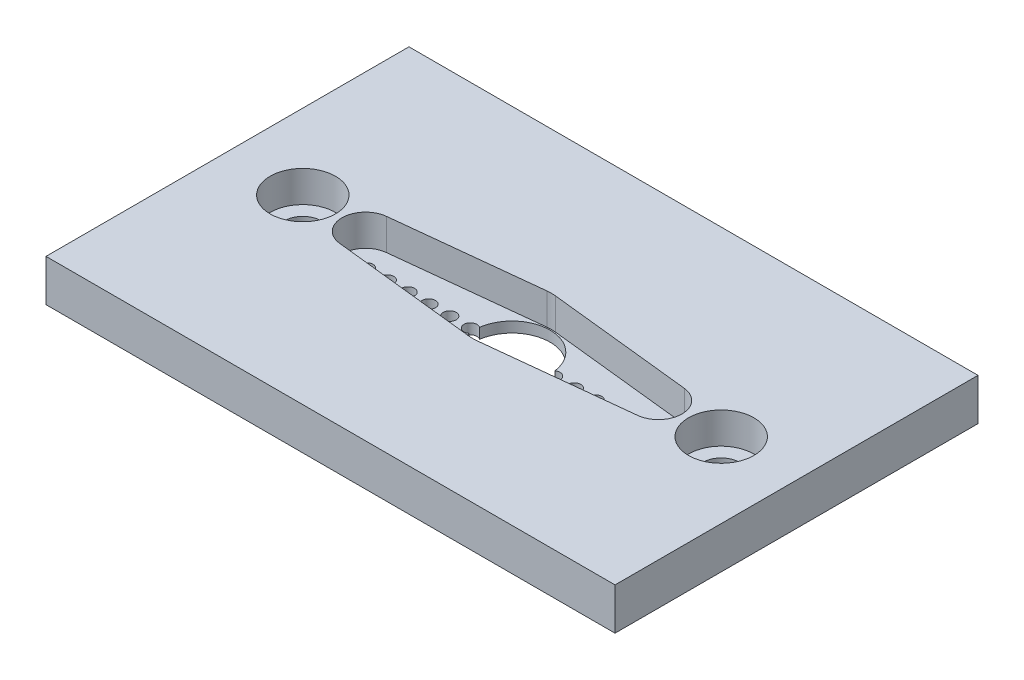
ISO-10303-21;
HEADER;
FILE_DESCRIPTION(('STEP AP214'),'2;1');
FILE_NAME('part.step','',(''),(''),'','','');
FILE_SCHEMA(('AUTOMOTIVE_DESIGN { 1 0 10303 214 1 1 1 1 }'));
ENDSEC;
DATA;
#1=APPLICATION_CONTEXT('core data for automotive mechanical design processes');
#2=APPLICATION_PROTOCOL_DEFINITION('international standard','automotive_design',2000,#1);
#3=PRODUCT_CONTEXT('',#1,'mechanical');
#4=PRODUCT('Part','Part','',(#3));
#5=PRODUCT_RELATED_PRODUCT_CATEGORY('part','',(#4));
#6=PRODUCT_DEFINITION_FORMATION('','',#4);
#7=PRODUCT_DEFINITION_CONTEXT('part definition',#1,'design');
#8=PRODUCT_DEFINITION('design','',#6,#7);
#9=PRODUCT_DEFINITION_SHAPE('','',#8);
#10=(LENGTH_UNIT() NAMED_UNIT(*) SI_UNIT(.MILLI.,.METRE.));
#11=(NAMED_UNIT(*) PLANE_ANGLE_UNIT() SI_UNIT($,.RADIAN.));
#12=(NAMED_UNIT(*) SI_UNIT($,.STERADIAN.) SOLID_ANGLE_UNIT());
#13=UNCERTAINTY_MEASURE_WITH_UNIT(LENGTH_MEASURE(1.E-05),#10,'distance_accuracy_value','');
#14=(GEOMETRIC_REPRESENTATION_CONTEXT(3) GLOBAL_UNCERTAINTY_ASSIGNED_CONTEXT((#13)) GLOBAL_UNIT_ASSIGNED_CONTEXT((#10,
#11,#12)) REPRESENTATION_CONTEXT('',''));
#15=CARTESIAN_POINT('',(0.,0.,0.));
#16=DIRECTION('',(0.,0.,1.));
#17=DIRECTION('',(1.,0.,0.));
#18=AXIS2_PLACEMENT_3D('',#15,#16,#17);
#19=CARTESIAN_POINT('',(0.,3.999992,0.));
#20=DIRECTION('',(0.,-1.,0.));
#21=DIRECTION('',(0.,0.,-1.));
#22=AXIS2_PLACEMENT_3D('',#19,#20,#21);
#23=PLANE('',#22);
#24=DIRECTION('',(-0.994202393285548,0.,0.107524886353294));
#25=VECTOR('',#24,1.);
#26=CARTESIAN_POINT('',(-14.2410688,3.999992,-2.2370542));
#27=LINE('',#26,#25);
#28=CARTESIAN_POINT('',(-0.4017772,3.999992,-3.7338));
#29=VERTEX_POINT('',#28);
#30=CARTESIAN_POINT('',(-14.2410688,3.999992,-2.2370542));
#31=VERTEX_POINT('',#30);
#32=EDGE_CURVE('E212',#29,#31,#27,.T.);
#33=ORIENTED_EDGE('',*,*,#32,.F.);
#34=CARTESIAN_POINT('',(0.,3.999992,-0.0188660218779237));
#35=DIRECTION('',(0.,1.,0.));
#36=DIRECTION('',(0.,0.,-1.));
#37=AXIS2_PLACEMENT_3D('',#34,#35,#36);
#38=CIRCLE('',#37,3.73659729971611);
#39=CARTESIAN_POINT('',(0.4017772,3.999992,-3.7338));
#40=VERTEX_POINT('',#39);
#41=EDGE_CURVE('E61',#40,#29,#38,.T.);
#42=ORIENTED_EDGE('',*,*,#41,.F.);
#43=DIRECTION('',(-0.994202393285548,0.,-0.107524886353294));
#44=VECTOR('',#43,1.);
#45=CARTESIAN_POINT('',(14.2410688,3.999992,-2.2370542));
#46=LINE('',#45,#44);
#47=CARTESIAN_POINT('',(14.2410688,3.999992,-2.2370542));
#48=VERTEX_POINT('',#47);
#49=EDGE_CURVE('E184',#48,#40,#46,.T.);
#50=ORIENTED_EDGE('',*,*,#49,.F.);
#51=CARTESIAN_POINT('',(13.9999960061156,3.999992,0.));
#52=DIRECTION('',(0.,1.,0.));
#53=DIRECTION('',(0.,0.,-1.));
#54=AXIS2_PLACEMENT_3D('',#51,#52,#53);
#55=CIRCLE('',#54,2.25000613014473);
#56=CARTESIAN_POINT('',(14.2410688,3.999992,2.2370542));
#57=VERTEX_POINT('',#56);
#58=EDGE_CURVE('E188',#57,#48,#55,.T.);
#59=ORIENTED_EDGE('',*,*,#58,.F.);
#60=DIRECTION('',(0.994202393285548,0.,-0.107524886353294));
#61=VECTOR('',#60,1.);
#62=CARTESIAN_POINT('',(14.2410688,3.999992,2.2370542));
#63=LINE('',#62,#61);
#64=CARTESIAN_POINT('',(0.4017772,3.999992,3.7338));
#65=VERTEX_POINT('',#64);
#66=EDGE_CURVE('E227',#65,#57,#63,.T.);
#67=ORIENTED_EDGE('',*,*,#66,.F.);
#68=CARTESIAN_POINT('',(0.,3.999992,0.0188660218779237));
#69=DIRECTION('',(0.,1.,0.));
#70=DIRECTION('',(0.,0.,1.));
#71=AXIS2_PLACEMENT_3D('',#68,#69,#70);
#72=CIRCLE('',#71,3.73659729971611);
#73=CARTESIAN_POINT('',(-0.4017772,3.999992,3.7338));
#74=VERTEX_POINT('',#73);
#75=EDGE_CURVE('E223',#74,#65,#72,.T.);
#76=ORIENTED_EDGE('',*,*,#75,.F.);
#77=DIRECTION('',(0.994202393285548,0.,0.107524886353294));
#78=VECTOR('',#77,1.);
#79=CARTESIAN_POINT('',(-14.2410688,3.999992,2.2370542));
#80=LINE('',#79,#78);
#81=CARTESIAN_POINT('',(-14.2410688,3.999992,2.2370542));
#82=VERTEX_POINT('',#81);
#83=EDGE_CURVE('E219',#82,#74,#80,.T.);
#84=ORIENTED_EDGE('',*,*,#83,.F.);
#85=CARTESIAN_POINT('',(-13.9999960061156,3.999992,0.));
#86=DIRECTION('',(0.,1.,0.));
#87=DIRECTION('',(0.,0.,1.));
#88=AXIS2_PLACEMENT_3D('',#85,#86,#87);
#89=CIRCLE('',#88,2.25000613014473);
#90=EDGE_CURVE('E215',#31,#82,#89,.T.);
#91=ORIENTED_EDGE('',*,*,#90,.F.);
#92=EDGE_LOOP('',(#33,#42,#50,#59,#67,#76,#84,#91));
#93=FACE_BOUND('',#92,.T.);
#94=DIRECTION('',(0.,0.,-1.));
#95=VECTOR('',#94,1.);
#96=CARTESIAN_POINT('',(27.1999964,3.999992,17.3500034));
#97=LINE('',#96,#95);
#98=CARTESIAN_POINT('',(27.1999964,3.999992,17.3500034));
#99=VERTEX_POINT('',#98);
#100=CARTESIAN_POINT('',(27.1999964,3.999992,-17.3500034));
#101=VERTEX_POINT('',#100);
#102=EDGE_CURVE('E406',#99,#101,#97,.T.);
#103=ORIENTED_EDGE('',*,*,#102,.T.);
#104=DIRECTION('',(-1.,0.,0.));
#105=VECTOR('',#104,1.);
#106=CARTESIAN_POINT('',(-27.1999964,3.999992,-17.3500034));
#107=LINE('',#106,#105);
#108=CARTESIAN_POINT('',(-27.1999964,3.999992,-17.3500034));
#109=VERTEX_POINT('',#108);
#110=EDGE_CURVE('E410',#101,#109,#107,.T.);
#111=ORIENTED_EDGE('',*,*,#110,.T.);
#112=DIRECTION('',(0.,0.,1.));
#113=VECTOR('',#112,1.);
#114=CARTESIAN_POINT('',(-27.1999964,3.999992,17.3500034));
#115=LINE('',#114,#113);
#116=CARTESIAN_POINT('',(-27.1999964,3.999992,17.3500034));
#117=VERTEX_POINT('',#116);
#118=EDGE_CURVE('E414',#109,#117,#115,.T.);
#119=ORIENTED_EDGE('',*,*,#118,.T.);
#120=DIRECTION('',(1.,0.,0.));
#121=VECTOR('',#120,1.);
#122=CARTESIAN_POINT('',(-27.1999964,3.999992,17.3500034));
#123=LINE('',#122,#121);
#124=EDGE_CURVE('E417',#117,#99,#123,.T.);
#125=ORIENTED_EDGE('',*,*,#124,.T.);
#126=EDGE_LOOP('',(#103,#111,#119,#125));
#127=FACE_BOUND('',#126,.T.);
#128=CARTESIAN_POINT('',(19.9999974153648,3.999992,0.));
#129=DIRECTION('',(0.,1.,0.));
#130=DIRECTION('',(0.,0.,-1.));
#131=AXIS2_PLACEMENT_3D('',#128,#129,#130);
#132=CIRCLE('',#131,3.12500078463523);
#133=CARTESIAN_POINT('',(19.9999974153648,3.999992,-3.12500078463523));
#134=VERTEX_POINT('',#133);
#135=EDGE_CURVE('E399',#134,#134,#132,.T.);
#136=ORIENTED_EDGE('',*,*,#135,.F.);
#137=EDGE_LOOP('',(#136));
#138=FACE_BOUND('',#137,.T.);
#139=CARTESIAN_POINT('',(-19.9999974153648,3.999992,0.));
#140=DIRECTION('',(0.,1.,0.));
#141=DIRECTION('',(0.,0.,1.));
#142=AXIS2_PLACEMENT_3D('',#139,#140,#141);
#143=CIRCLE('',#142,3.12500078463523);
#144=CARTESIAN_POINT('',(-19.9999974153648,3.999992,3.12500078463523));
#145=VERTEX_POINT('',#144);
#146=EDGE_CURVE('E395',#145,#145,#143,.T.);
#147=ORIENTED_EDGE('',*,*,#146,.F.);
#148=EDGE_LOOP('',(#147));
#149=FACE_BOUND('',#148,.T.);
#150=ADVANCED_FACE('F44',(#93,#127,#138,#149),#23,.F.);
#151=CARTESIAN_POINT('',(0.,0.,0.));
#152=DIRECTION('',(0.,-1.,0.));
#153=DIRECTION('',(0.,0.,-1.));
#154=AXIS2_PLACEMENT_3D('',#151,#152,#153);
#155=PLANE('',#154);
#156=CARTESIAN_POINT('',(0.,0.,0.));
#157=DIRECTION('',(0.,1.,0.));
#158=DIRECTION('',(0.,0.,1.));
#159=AXIS2_PLACEMENT_3D('',#156,#157,#158);
#160=CIRCLE('',#159,3.6400486);
#161=CARTESIAN_POINT('',(-3.60507442956767,0.,0.503380738248163));
#162=VERTEX_POINT('',#161);
#163=CARTESIAN_POINT('',(3.60507442956768,0.,0.503380738248161));
#164=VERTEX_POINT('',#163);
#165=EDGE_CURVE('E337',#162,#164,#160,.T.);
#166=ORIENTED_EDGE('',*,*,#165,.T.);
#167=CARTESIAN_POINT('',(3.97096571298684,0.,0.));
#168=DIRECTION('',(0.,1.,0.));
#169=DIRECTION('',(0.,0.,1.));
#170=AXIS2_PLACEMENT_3D('',#167,#168,#169);
#171=CIRCLE('',#170,0.622309086323978);
#172=CARTESIAN_POINT('',(3.60507442956768,0.,-0.503380738248163));
#173=VERTEX_POINT('',#172);
#174=EDGE_CURVE('E325',#173,#164,#171,.F.);
#175=ORIENTED_EDGE('',*,*,#174,.F.);
#176=CARTESIAN_POINT('',(0.,0.,0.));
#177=DIRECTION('',(0.,1.,0.));
#178=DIRECTION('',(0.,0.,1.));
#179=AXIS2_PLACEMENT_3D('',#176,#177,#178);
#180=CIRCLE('',#179,3.6400486);
#181=CARTESIAN_POINT('',(-3.60507442956768,0.,-0.503380738248163));
#182=VERTEX_POINT('',#181);
#183=EDGE_CURVE('E328',#173,#182,#180,.T.);
#184=ORIENTED_EDGE('',*,*,#183,.T.);
#185=CARTESIAN_POINT('',(-3.97096571298683,0.,0.));
#186=DIRECTION('',(0.,1.,0.));
#187=DIRECTION('',(0.,0.,1.));
#188=AXIS2_PLACEMENT_3D('',#185,#186,#187);
#189=CIRCLE('',#188,0.622309086323979);
#190=EDGE_CURVE('E333',#182,#162,#189,.T.);
#191=ORIENTED_EDGE('',*,*,#190,.T.);
#192=EDGE_LOOP('',(#166,#175,#184,#191));
#193=FACE_BOUND('',#192,.T.);
#194=CARTESIAN_POINT('',(5.95958014930643,0.,0.00053283432397788));
#195=DIRECTION('',(0.,1.,0.));
#196=DIRECTION('',(0.,0.,1.));
#197=AXIS2_PLACEMENT_3D('',#194,#195,#196);
#198=CIRCLE('',#197,0.621776251999998);
#199=CARTESIAN_POINT('',(5.95958014930643,0.,0.622309086323975));
#200=VERTEX_POINT('',#199);
#201=EDGE_CURVE('E329',#200,#200,#198,.F.);
#202=ORIENTED_EDGE('',*,*,#201,.F.);
#203=EDGE_LOOP('',(#202));
#204=FACE_BOUND('',#203,.T.);
#205=CARTESIAN_POINT('',(9.93680917730643,0.,0.000532834323978097));
#206=DIRECTION('',(0.,1.,0.));
#207=DIRECTION('',(0.,0.,1.));
#208=AXIS2_PLACEMENT_3D('',#205,#206,#207);
#209=CIRCLE('',#208,0.621776252000001);
#210=CARTESIAN_POINT('',(9.93680917730643,0.,0.622309086323979));
#211=VERTEX_POINT('',#210);
#212=EDGE_CURVE('E359',#211,#211,#209,.F.);
#213=ORIENTED_EDGE('',*,*,#212,.F.);
#214=EDGE_LOOP('',(#213));
#215=FACE_BOUND('',#214,.T.);
#216=CARTESIAN_POINT('',(7.94819474098684,0.,0.));
#217=DIRECTION('',(0.,1.,0.));
#218=DIRECTION('',(0.,0.,1.));
#219=AXIS2_PLACEMENT_3D('',#216,#217,#218);
#220=CIRCLE('',#219,0.622309086323977);
#221=CARTESIAN_POINT('',(7.94819474098684,0.,0.622309086323976));
#222=VERTEX_POINT('',#221);
#223=EDGE_CURVE('E363',#222,#222,#220,.F.);
#224=ORIENTED_EDGE('',*,*,#223,.F.);
#225=EDGE_LOOP('',(#224));
#226=FACE_BOUND('',#225,.T.);
#227=CARTESIAN_POINT('',(11.9254237689868,0.,0.));
#228=DIRECTION('',(0.,1.,0.));
#229=DIRECTION('',(0.,0.,1.));
#230=AXIS2_PLACEMENT_3D('',#227,#228,#229);
#231=CIRCLE('',#230,0.622309086323977);
#232=CARTESIAN_POINT('',(11.9254237689868,0.,0.622309086324004));
#233=VERTEX_POINT('',#232);
#234=EDGE_CURVE('E367',#233,#233,#231,.F.);
#235=ORIENTED_EDGE('',*,*,#234,.F.);
#236=EDGE_LOOP('',(#235));
#237=FACE_BOUND('',#236,.T.);
#238=CARTESIAN_POINT('',(13.9140382053064,0.,0.000532834324005419));
#239=DIRECTION('',(0.,1.,0.));
#240=DIRECTION('',(0.,0.,1.));
#241=AXIS2_PLACEMENT_3D('',#238,#239,#240);
#242=CIRCLE('',#241,0.621776252000001);
#243=CARTESIAN_POINT('',(13.9140382053064,0.,0.622309086324007));
#244=VERTEX_POINT('',#243);
#245=EDGE_CURVE('E302',#244,#244,#242,.F.);
#246=ORIENTED_EDGE('',*,*,#245,.F.);
#247=EDGE_LOOP('',(#246));
#248=FACE_BOUND('',#247,.T.);
#249=CARTESIAN_POINT('',(-19.9999974153648,0.,0.));
#250=DIRECTION('',(0.,1.,0.));
#251=DIRECTION('',(0.,0.,1.));
#252=AXIS2_PLACEMENT_3D('',#249,#250,#251);
#253=CIRCLE('',#252,1.7499965);
#254=CARTESIAN_POINT('',(-19.9999974153648,0.,1.7499965));
#255=VERTEX_POINT('',#254);
#256=EDGE_CURVE('E374',#255,#255,#253,.T.);
#257=ORIENTED_EDGE('',*,*,#256,.T.);
#258=EDGE_LOOP('',(#257));
#259=FACE_BOUND('',#258,.T.);
#260=CARTESIAN_POINT('',(19.9999974153648,0.,0.));
#261=DIRECTION('',(0.,1.,0.));
#262=DIRECTION('',(0.,0.,-1.));
#263=AXIS2_PLACEMENT_3D('',#260,#261,#262);
#264=CIRCLE('',#263,1.7499965);
#265=CARTESIAN_POINT('',(19.9999974153648,0.,-1.7499965));
#266=VERTEX_POINT('',#265);
#267=EDGE_CURVE('E307',#266,#266,#264,.T.);
#268=ORIENTED_EDGE('',*,*,#267,.T.);
#269=EDGE_LOOP('',(#268));
#270=FACE_BOUND('',#269,.T.);
#271=DIRECTION('',(0.,0.,-1.));
#272=VECTOR('',#271,1.);
#273=CARTESIAN_POINT('',(27.1999964,0.,17.3500034));
#274=LINE('',#273,#272);
#275=CARTESIAN_POINT('',(27.1999964,0.,17.3500034));
#276=VERTEX_POINT('',#275);
#277=CARTESIAN_POINT('',(27.1999964,0.,-17.3500034));
#278=VERTEX_POINT('',#277);
#279=EDGE_CURVE('E394',#276,#278,#274,.T.);
#280=ORIENTED_EDGE('',*,*,#279,.F.);
#281=DIRECTION('',(1.,0.,0.));
#282=VECTOR('',#281,1.);
#283=CARTESIAN_POINT('',(-27.1999964,0.,17.3500034));
#284=LINE('',#283,#282);
#285=CARTESIAN_POINT('',(-27.1999964,0.,17.3500034));
#286=VERTEX_POINT('',#285);
#287=EDGE_CURVE('E411',#286,#276,#284,.T.);
#288=ORIENTED_EDGE('',*,*,#287,.F.);
#289=DIRECTION('',(0.,0.,1.));
#290=VECTOR('',#289,1.);
#291=CARTESIAN_POINT('',(-27.1999964,0.,17.3500034));
#292=LINE('',#291,#290);
#293=CARTESIAN_POINT('',(-27.1999964,0.,-17.3500034));
#294=VERTEX_POINT('',#293);
#295=EDGE_CURVE('E427',#294,#286,#292,.T.);
#296=ORIENTED_EDGE('',*,*,#295,.F.);
#297=DIRECTION('',(-1.,0.,0.));
#298=VECTOR('',#297,1.);
#299=CARTESIAN_POINT('',(-27.1999964,0.,-17.3500034));
#300=LINE('',#299,#298);
#301=EDGE_CURVE('E424',#278,#294,#300,.T.);
#302=ORIENTED_EDGE('',*,*,#301,.F.);
#303=EDGE_LOOP('',(#280,#288,#296,#302));
#304=FACE_BOUND('',#303,.T.);
#305=CARTESIAN_POINT('',(-5.95958014930642,0.,0.000532834323978531));
#306=DIRECTION('',(0.,1.,0.));
#307=DIRECTION('',(0.,0.,1.));
#308=AXIS2_PLACEMENT_3D('',#305,#306,#307);
#309=CIRCLE('',#308,0.621776251999999);
#310=CARTESIAN_POINT('',(-5.95958014930642,0.,0.622309086323978));
#311=VERTEX_POINT('',#310);
#312=EDGE_CURVE('E320',#311,#311,#309,.T.);
#313=ORIENTED_EDGE('',*,*,#312,.T.);
#314=EDGE_LOOP('',(#313));
#315=FACE_BOUND('',#314,.T.);
#316=CARTESIAN_POINT('',(-7.94819474098683,0.,0.));
#317=DIRECTION('',(0.,1.,0.));
#318=DIRECTION('',(0.,0.,1.));
#319=AXIS2_PLACEMENT_3D('',#316,#317,#318);
#320=CIRCLE('',#319,0.622309086323979);
#321=CARTESIAN_POINT('',(-7.94819474098683,0.,0.622309086323979));
#322=VERTEX_POINT('',#321);
#323=EDGE_CURVE('E316',#322,#322,#320,.T.);
#324=ORIENTED_EDGE('',*,*,#323,.T.);
#325=EDGE_LOOP('',(#324));
#326=FACE_BOUND('',#325,.T.);
#327=CARTESIAN_POINT('',(-9.93680917730642,0.,0.000532834323979398));
#328=DIRECTION('',(0.,1.,0.));
#329=DIRECTION('',(0.,0.,1.));
#330=AXIS2_PLACEMENT_3D('',#327,#328,#329);
#331=CIRCLE('',#330,0.621776251999999);
#332=CARTESIAN_POINT('',(-9.93680917730642,0.,0.622309086323979));
#333=VERTEX_POINT('',#332);
#334=EDGE_CURVE('E312',#333,#333,#331,.T.);
#335=ORIENTED_EDGE('',*,*,#334,.T.);
#336=EDGE_LOOP('',(#335));
#337=FACE_BOUND('',#336,.T.);
#338=CARTESIAN_POINT('',(-11.9254237689868,0.,0.));
#339=DIRECTION('',(0.,1.,0.));
#340=DIRECTION('',(0.,0.,1.));
#341=AXIS2_PLACEMENT_3D('',#338,#339,#340);
#342=CIRCLE('',#341,0.622309086323979);
#343=CARTESIAN_POINT('',(-11.9254237689868,0.,0.622309086324007));
#344=VERTEX_POINT('',#343);
#345=EDGE_CURVE('E308',#344,#344,#342,.T.);
#346=ORIENTED_EDGE('',*,*,#345,.T.);
#347=EDGE_LOOP('',(#346));
#348=FACE_BOUND('',#347,.T.);
#349=CARTESIAN_POINT('',(-13.9140382053064,0.,0.000532834324007154));
#350=DIRECTION('',(0.,1.,0.));
#351=DIRECTION('',(0.,0.,1.));
#352=AXIS2_PLACEMENT_3D('',#349,#350,#351);
#353=CIRCLE('',#352,0.621776251999999);
#354=CARTESIAN_POINT('',(-13.9140382053064,0.,0.622309086324007));
#355=VERTEX_POINT('',#354);
#356=EDGE_CURVE('E303',#355,#355,#353,.T.);
#357=ORIENTED_EDGE('',*,*,#356,.T.);
#358=EDGE_LOOP('',(#357));
#359=FACE_BOUND('',#358,.T.);
#360=ADVANCED_FACE('F451',(#193,#204,#215,#226,#237,#248,#259,#270,#304,#315,#326,#337,#348,
#359),#155,.T.);
#361=CARTESIAN_POINT('',(27.1999964,3.999992,17.3500034));
#362=DIRECTION('',(-1.,0.,0.));
#363=DIRECTION('',(0.,0.,1.));
#364=AXIS2_PLACEMENT_3D('',#361,#362,#363);
#365=PLANE('',#364);
#366=ORIENTED_EDGE('',*,*,#279,.T.);
#367=DIRECTION('',(0.,-1.,0.));
#368=VECTOR('',#367,1.);
#369=CARTESIAN_POINT('',(27.1999964,3.999992,-17.3500034));
#370=LINE('',#369,#368);
#371=EDGE_CURVE('E11',#101,#278,#370,.T.);
#372=ORIENTED_EDGE('',*,*,#371,.F.);
#373=ORIENTED_EDGE('',*,*,#102,.F.);
#374=DIRECTION('',(0.,-1.,0.));
#375=VECTOR('',#374,1.);
#376=CARTESIAN_POINT('',(27.1999964,3.999992,17.3500034));
#377=LINE('',#376,#375);
#378=EDGE_CURVE('E420',#99,#276,#377,.T.);
#379=ORIENTED_EDGE('',*,*,#378,.T.);
#380=EDGE_LOOP('',(#366,#372,#373,#379));
#381=FACE_BOUND('',#380,.T.);
#382=ADVANCED_FACE('F46',(#381),#365,.F.);
#383=CARTESIAN_POINT('',(-27.1999964,3.999992,-17.3500034));
#384=DIRECTION('',(0.,0.,1.));
#385=DIRECTION('',(1.,0.,0.));
#386=AXIS2_PLACEMENT_3D('',#383,#384,#385);
#387=PLANE('',#386);
#388=ORIENTED_EDGE('',*,*,#301,.T.);
#389=DIRECTION('',(0.,-1.,0.));
#390=VECTOR('',#389,1.);
#391=CARTESIAN_POINT('',(-27.1999964,3.999992,-17.3500034));
#392=LINE('',#391,#390);
#393=EDGE_CURVE('E54',#109,#294,#392,.T.);
#394=ORIENTED_EDGE('',*,*,#393,.F.);
#395=ORIENTED_EDGE('',*,*,#110,.F.);
#396=ORIENTED_EDGE('',*,*,#371,.T.);
#397=EDGE_LOOP('',(#388,#394,#395,#396));
#398=FACE_BOUND('',#397,.T.);
#399=ADVANCED_FACE('F462',(#398),#387,.F.);
#400=CARTESIAN_POINT('',(-27.1999964,3.999992,17.3500034));
#401=DIRECTION('',(1.,0.,0.));
#402=DIRECTION('',(0.,0.,-1.));
#403=AXIS2_PLACEMENT_3D('',#400,#401,#402);
#404=PLANE('',#403);
#405=ORIENTED_EDGE('',*,*,#295,.T.);
#406=DIRECTION('',(0.,-1.,0.));
#407=VECTOR('',#406,1.);
#408=CARTESIAN_POINT('',(-27.1999964,3.999992,17.3500034));
#409=LINE('',#408,#407);
#410=EDGE_CURVE('E435',#117,#286,#409,.T.);
#411=ORIENTED_EDGE('',*,*,#410,.F.);
#412=ORIENTED_EDGE('',*,*,#118,.F.);
#413=ORIENTED_EDGE('',*,*,#393,.T.);
#414=EDGE_LOOP('',(#405,#411,#412,#413));
#415=FACE_BOUND('',#414,.T.);
#416=ADVANCED_FACE('F445',(#415),#404,.F.);
#417=CARTESIAN_POINT('',(-27.1999964,3.999992,17.3500034));
#418=DIRECTION('',(0.,0.,-1.));
#419=DIRECTION('',(-1.,0.,0.));
#420=AXIS2_PLACEMENT_3D('',#417,#418,#419);
#421=PLANE('',#420);
#422=ORIENTED_EDGE('',*,*,#287,.T.);
#423=ORIENTED_EDGE('',*,*,#378,.F.);
#424=ORIENTED_EDGE('',*,*,#124,.F.);
#425=ORIENTED_EDGE('',*,*,#410,.T.);
#426=EDGE_LOOP('',(#422,#423,#424,#425));
#427=FACE_BOUND('',#426,.T.);
#428=ADVANCED_FACE('F455',(#427),#421,.F.);
#429=CARTESIAN_POINT('',(19.9999974153648,0.999998,0.));
#430=DIRECTION('',(0.,1.,0.));
#431=DIRECTION('',(0.,0.,1.));
#432=AXIS2_PLACEMENT_3D('',#429,#430,#431);
#433=CYLINDRICAL_SURFACE('',#432,3.12500078463523);
#434=CARTESIAN_POINT('',(19.9999974153648,0.999998,0.));
#435=DIRECTION('',(0.,1.,0.));
#436=DIRECTION('',(0.,0.,-1.));
#437=AXIS2_PLACEMENT_3D('',#434,#435,#436);
#438=CIRCLE('',#437,3.12500078463523);
#439=CARTESIAN_POINT('',(19.9999974153648,0.999998,-3.12500078463523));
#440=VERTEX_POINT('',#439);
#441=EDGE_CURVE('E378',#440,#440,#438,.T.);
#442=ORIENTED_EDGE('',*,*,#441,.F.);
#443=EDGE_LOOP('',(#442));
#444=FACE_BOUND('',#443,.T.);
#445=ORIENTED_EDGE('',*,*,#135,.T.);
#446=EDGE_LOOP('',(#445));
#447=FACE_BOUND('',#446,.T.);
#448=ADVANCED_FACE('F483',(#444,#447),#433,.F.);
#449=CARTESIAN_POINT('',(19.9999974153648,0.999998,0.));
#450=DIRECTION('',(0.,-1.,0.));
#451=DIRECTION('',(0.,0.,-1.));
#452=AXIS2_PLACEMENT_3D('',#449,#450,#451);
#453=PLANE('',#452);
#454=CARTESIAN_POINT('',(19.9999974153648,0.999998,0.));
#455=DIRECTION('',(0.,1.,0.));
#456=DIRECTION('',(0.,0.,-1.));
#457=AXIS2_PLACEMENT_3D('',#454,#455,#456);
#458=CIRCLE('',#457,1.7499965);
#459=CARTESIAN_POINT('',(19.9999974153648,0.999998,-1.7499965));
#460=VERTEX_POINT('',#459);
#461=EDGE_CURVE('E383',#460,#460,#458,.T.);
#462=ORIENTED_EDGE('',*,*,#461,.F.);
#463=EDGE_LOOP('',(#462));
#464=FACE_BOUND('',#463,.T.);
#465=ORIENTED_EDGE('',*,*,#441,.T.);
#466=EDGE_LOOP('',(#465));
#467=FACE_BOUND('',#466,.T.);
#468=ADVANCED_FACE('F479',(#464,#467),#453,.F.);
#469=CARTESIAN_POINT('',(-19.9999974153648,0.999998,0.));
#470=DIRECTION('',(0.,1.,0.));
#471=DIRECTION('',(0.,0.,1.));
#472=AXIS2_PLACEMENT_3D('',#469,#470,#471);
#473=CYLINDRICAL_SURFACE('',#472,3.12500078463523);
#474=CARTESIAN_POINT('',(-19.9999974153648,0.999998,0.));
#475=DIRECTION('',(0.,1.,0.));
#476=DIRECTION('',(0.,0.,1.));
#477=AXIS2_PLACEMENT_3D('',#474,#475,#476);
#478=CIRCLE('',#477,3.12500078463523);
#479=CARTESIAN_POINT('',(-19.9999974153648,0.999998,3.12500078463523));
#480=VERTEX_POINT('',#479);
#481=EDGE_CURVE('E390',#480,#480,#478,.T.);
#482=ORIENTED_EDGE('',*,*,#481,.F.);
#483=EDGE_LOOP('',(#482));
#484=FACE_BOUND('',#483,.T.);
#485=ORIENTED_EDGE('',*,*,#146,.T.);
#486=EDGE_LOOP('',(#485));
#487=FACE_BOUND('',#486,.T.);
#488=ADVANCED_FACE('F492',(#484,#487),#473,.F.);
#489=CARTESIAN_POINT('',(-19.9999974153648,0.999998,0.));
#490=DIRECTION('',(0.,1.,0.));
#491=DIRECTION('',(0.,0.,1.));
#492=AXIS2_PLACEMENT_3D('',#489,#490,#491);
#493=PLANE('',#492);
#494=CARTESIAN_POINT('',(-19.9999974153648,0.999998,0.));
#495=DIRECTION('',(0.,1.,0.));
#496=DIRECTION('',(0.,0.,1.));
#497=AXIS2_PLACEMENT_3D('',#494,#495,#496);
#498=CIRCLE('',#497,1.7499965);
#499=CARTESIAN_POINT('',(-19.9999974153648,0.999998,1.7499965));
#500=VERTEX_POINT('',#499);
#501=EDGE_CURVE('E379',#500,#500,#498,.T.);
#502=ORIENTED_EDGE('',*,*,#501,.F.);
#503=EDGE_LOOP('',(#502));
#504=FACE_BOUND('',#503,.T.);
#505=ORIENTED_EDGE('',*,*,#481,.T.);
#506=EDGE_LOOP('',(#505));
#507=FACE_BOUND('',#506,.T.);
#508=ADVANCED_FACE('F498',(#504,#507),#493,.T.);
#509=CARTESIAN_POINT('',(19.9999974153648,0.,0.));
#510=DIRECTION('',(0.,1.,0.));
#511=DIRECTION('',(0.,0.,1.));
#512=AXIS2_PLACEMENT_3D('',#509,#510,#511);
#513=CYLINDRICAL_SURFACE('',#512,1.7499965);
#514=ORIENTED_EDGE('',*,*,#267,.F.);
#515=EDGE_LOOP('',(#514));
#516=FACE_BOUND('',#515,.T.);
#517=ORIENTED_EDGE('',*,*,#461,.T.);
#518=EDGE_LOOP('',(#517));
#519=FACE_BOUND('',#518,.T.);
#520=ADVANCED_FACE('F502',(#516,#519),#513,.F.);
#521=CARTESIAN_POINT('',(-19.9999974153648,0.,0.));
#522=DIRECTION('',(0.,1.,0.));
#523=DIRECTION('',(0.,0.,1.));
#524=AXIS2_PLACEMENT_3D('',#521,#522,#523);
#525=CYLINDRICAL_SURFACE('',#524,1.7499965);
#526=ORIENTED_EDGE('',*,*,#256,.F.);
#527=EDGE_LOOP('',(#526));
#528=FACE_BOUND('',#527,.T.);
#529=ORIENTED_EDGE('',*,*,#501,.T.);
#530=EDGE_LOOP('',(#529));
#531=FACE_BOUND('',#530,.T.);
#532=ADVANCED_FACE('F506',(#528,#531),#525,.F.);
#533=CARTESIAN_POINT('',(13.9140382053064,0.,0.000532834324005419));
#534=DIRECTION('',(0.,1.,0.));
#535=DIRECTION('',(0.,0.,1.));
#536=AXIS2_PLACEMENT_3D('',#533,#534,#535);
#537=CYLINDRICAL_SURFACE('',#536,0.621776252000001);
#538=CARTESIAN_POINT('',(13.9140382053064,0.999998,0.000532834324005419));
#539=DIRECTION('',(0.,-1.,0.));
#540=DIRECTION('',(0.,0.,-1.));
#541=AXIS2_PLACEMENT_3D('',#538,#539,#540);
#542=CIRCLE('',#541,0.621776252000001);
#543=CARTESIAN_POINT('',(13.9140382053064,0.999998,-0.621243417675996));
#544=VERTEX_POINT('',#543);
#545=EDGE_CURVE('E298',#544,#544,#542,.T.);
#546=ORIENTED_EDGE('',*,*,#545,.F.);
#547=EDGE_LOOP('',(#546));
#548=FACE_BOUND('',#547,.T.);
#549=ORIENTED_EDGE('',*,*,#245,.T.);
#550=EDGE_LOOP('',(#549));
#551=FACE_BOUND('',#550,.T.);
#552=ADVANCED_FACE('F510',(#548,#551),#537,.F.);
#553=CARTESIAN_POINT('',(11.9254237689868,0.,0.));
#554=DIRECTION('',(0.,1.,0.));
#555=DIRECTION('',(0.,0.,1.));
#556=AXIS2_PLACEMENT_3D('',#553,#554,#555);
#557=CYLINDRICAL_SURFACE('',#556,0.622309086323977);
#558=CARTESIAN_POINT('',(11.9254237689868,0.999998,0.));
#559=DIRECTION('',(0.,-1.,0.));
#560=DIRECTION('',(0.,0.,-1.));
#561=AXIS2_PLACEMENT_3D('',#558,#559,#560);
#562=CIRCLE('',#561,0.622309086323977);
#563=CARTESIAN_POINT('',(11.9254237689868,0.999998,-0.62230908632395));
#564=VERTEX_POINT('',#563);
#565=EDGE_CURVE('E294',#564,#564,#562,.T.);
#566=ORIENTED_EDGE('',*,*,#565,.F.);
#567=EDGE_LOOP('',(#566));
#568=FACE_BOUND('',#567,.T.);
#569=ORIENTED_EDGE('',*,*,#234,.T.);
#570=EDGE_LOOP('',(#569));
#571=FACE_BOUND('',#570,.T.);
#572=ADVANCED_FACE('F513',(#568,#571),#557,.F.);
#573=CARTESIAN_POINT('',(7.94819474098684,0.,0.));
#574=DIRECTION('',(0.,1.,0.));
#575=DIRECTION('',(0.,0.,1.));
#576=AXIS2_PLACEMENT_3D('',#573,#574,#575);
#577=CYLINDRICAL_SURFACE('',#576,0.622309086323977);
#578=CARTESIAN_POINT('',(7.94819474098684,0.999998,0.));
#579=DIRECTION('',(0.,-1.,0.));
#580=DIRECTION('',(0.,0.,-1.));
#581=AXIS2_PLACEMENT_3D('',#578,#579,#580);
#582=CIRCLE('',#581,0.622309086323977);
#583=CARTESIAN_POINT('',(7.94819474098684,0.999998,-0.622309086323977));
#584=VERTEX_POINT('',#583);
#585=EDGE_CURVE('E290',#584,#584,#582,.T.);
#586=ORIENTED_EDGE('',*,*,#585,.F.);
#587=EDGE_LOOP('',(#586));
#588=FACE_BOUND('',#587,.T.);
#589=ORIENTED_EDGE('',*,*,#223,.T.);
#590=EDGE_LOOP('',(#589));
#591=FACE_BOUND('',#590,.T.);
#592=ADVANCED_FACE('F517',(#588,#591),#577,.F.);
#593=CARTESIAN_POINT('',(9.93680917730643,0.,0.000532834323978097));
#594=DIRECTION('',(0.,1.,0.));
#595=DIRECTION('',(0.,0.,1.));
#596=AXIS2_PLACEMENT_3D('',#593,#594,#595);
#597=CYLINDRICAL_SURFACE('',#596,0.621776252000001);
#598=CARTESIAN_POINT('',(9.93680917730643,0.999998,0.000532834323978097));
#599=DIRECTION('',(0.,-1.,0.));
#600=DIRECTION('',(0.,0.,-1.));
#601=AXIS2_PLACEMENT_3D('',#598,#599,#600);
#602=CIRCLE('',#601,0.621776252000001);
#603=CARTESIAN_POINT('',(9.93680917730643,0.999998,-0.621243417676023));
#604=VERTEX_POINT('',#603);
#605=EDGE_CURVE('E286',#604,#604,#602,.T.);
#606=ORIENTED_EDGE('',*,*,#605,.F.);
#607=EDGE_LOOP('',(#606));
#608=FACE_BOUND('',#607,.T.);
#609=ORIENTED_EDGE('',*,*,#212,.T.);
#610=EDGE_LOOP('',(#609));
#611=FACE_BOUND('',#610,.T.);
#612=ADVANCED_FACE('F521',(#608,#611),#597,.F.);
#613=CARTESIAN_POINT('',(5.95958014930643,0.,0.00053283432397788));
#614=DIRECTION('',(0.,1.,0.));
#615=DIRECTION('',(0.,0.,1.));
#616=AXIS2_PLACEMENT_3D('',#613,#614,#615);
#617=CYLINDRICAL_SURFACE('',#616,0.621776251999998);
#618=CARTESIAN_POINT('',(5.95958014930643,0.999998,0.00053283432397788));
#619=DIRECTION('',(0.,-1.,0.));
#620=DIRECTION('',(0.,0.,-1.));
#621=AXIS2_PLACEMENT_3D('',#618,#619,#620);
#622=CIRCLE('',#621,0.621776251999998);
#623=CARTESIAN_POINT('',(5.95958014930643,0.999998,-0.62124341767602));
#624=VERTEX_POINT('',#623);
#625=EDGE_CURVE('E282',#624,#624,#622,.T.);
#626=ORIENTED_EDGE('',*,*,#625,.F.);
#627=EDGE_LOOP('',(#626));
#628=FACE_BOUND('',#627,.T.);
#629=ORIENTED_EDGE('',*,*,#201,.T.);
#630=EDGE_LOOP('',(#629));
#631=FACE_BOUND('',#630,.T.);
#632=ADVANCED_FACE('F525',(#628,#631),#617,.F.);
#633=CARTESIAN_POINT('',(3.97096571298684,0.,0.));
#634=DIRECTION('',(0.,1.,0.));
#635=DIRECTION('',(0.,0.,1.));
#636=AXIS2_PLACEMENT_3D('',#633,#634,#635);
#637=CYLINDRICAL_SURFACE('',#636,0.622309086323978);
#638=CARTESIAN_POINT('',(3.97096571298684,0.999998,0.));
#639=DIRECTION('',(0.,-1.,0.));
#640=DIRECTION('',(0.,0.,-1.));
#641=AXIS2_PLACEMENT_3D('',#638,#639,#640);
#642=CIRCLE('',#641,0.622309086323978);
#643=CARTESIAN_POINT('',(3.60507442956767,0.999998,-0.503380738248163));
#644=VERTEX_POINT('',#643);
#645=CARTESIAN_POINT('',(3.60507442956768,0.999998,0.503380738248161));
#646=VERTEX_POINT('',#645);
#647=EDGE_CURVE('E279',#644,#646,#642,.T.);
#648=ORIENTED_EDGE('',*,*,#647,.F.);
#649=DIRECTION('',(0.,1.,0.));
#650=VECTOR('',#649,1.);
#651=CARTESIAN_POINT('',(3.60507442956768,0.,-0.503380738248163));
#652=LINE('',#651,#650);
#653=EDGE_CURVE('E341',#173,#644,#652,.T.);
#654=ORIENTED_EDGE('',*,*,#653,.F.);
#655=ORIENTED_EDGE('',*,*,#174,.T.);
#656=DIRECTION('',(0.,1.,0.));
#657=VECTOR('',#656,1.);
#658=CARTESIAN_POINT('',(3.60507442956768,0.,0.503380738248161));
#659=LINE('',#658,#657);
#660=EDGE_CURVE('E324',#164,#646,#659,.T.);
#661=ORIENTED_EDGE('',*,*,#660,.T.);
#662=EDGE_LOOP('',(#648,#654,#655,#661));
#663=FACE_BOUND('',#662,.T.);
#664=ADVANCED_FACE('F529',(#663),#637,.F.);
#665=CARTESIAN_POINT('',(0.,0.,0.));
#666=DIRECTION('',(0.,1.,0.));
#667=DIRECTION('',(0.,0.,1.));
#668=AXIS2_PLACEMENT_3D('',#665,#666,#667);
#669=CYLINDRICAL_SURFACE('',#668,3.6400486);
#670=DIRECTION('',(0.,1.,0.));
#671=VECTOR('',#670,1.);
#672=CARTESIAN_POINT('',(-3.60507442956767,0.,0.503380738248163));
#673=LINE('',#672,#671);
#674=CARTESIAN_POINT('',(-3.60507442956767,0.999998,0.503380738248164));
#675=VERTEX_POINT('',#674);
#676=EDGE_CURVE('E345',#162,#675,#673,.T.);
#677=ORIENTED_EDGE('',*,*,#676,.T.);
#678=CARTESIAN_POINT('',(0.,0.999998,0.));
#679=DIRECTION('',(0.,-1.,0.));
#680=DIRECTION('',(0.,0.,-1.));
#681=AXIS2_PLACEMENT_3D('',#678,#679,#680);
#682=CIRCLE('',#681,3.6400486);
#683=EDGE_CURVE('E275',#675,#646,#682,.F.);
#684=ORIENTED_EDGE('',*,*,#683,.T.);
#685=ORIENTED_EDGE('',*,*,#660,.F.);
#686=ORIENTED_EDGE('',*,*,#165,.F.);
#687=EDGE_LOOP('',(#677,#684,#685,#686));
#688=FACE_BOUND('',#687,.T.);
#689=ADVANCED_FACE('F533',(#688),#669,.F.);
#690=CARTESIAN_POINT('',(-3.97096571298683,0.,0.));
#691=DIRECTION('',(0.,1.,0.));
#692=DIRECTION('',(0.,0.,1.));
#693=AXIS2_PLACEMENT_3D('',#690,#691,#692);
#694=CYLINDRICAL_SURFACE('',#693,0.622309086323979);
#695=DIRECTION('',(0.,1.,0.));
#696=VECTOR('',#695,1.);
#697=CARTESIAN_POINT('',(-3.60507442956767,0.,-0.503380738248163));
#698=LINE('',#697,#696);
#699=CARTESIAN_POINT('',(-3.60507442956767,0.999998,-0.503380738248163));
#700=VERTEX_POINT('',#699);
#701=EDGE_CURVE('E349',#182,#700,#698,.T.);
#702=ORIENTED_EDGE('',*,*,#701,.T.);
#703=CARTESIAN_POINT('',(-3.97096571298683,0.999998,0.));
#704=DIRECTION('',(0.,-1.,0.));
#705=DIRECTION('',(0.,0.,-1.));
#706=AXIS2_PLACEMENT_3D('',#703,#704,#705);
#707=CIRCLE('',#706,0.622309086323979);
#708=EDGE_CURVE('E69',#700,#675,#707,.F.);
#709=ORIENTED_EDGE('',*,*,#708,.T.);
#710=ORIENTED_EDGE('',*,*,#676,.F.);
#711=ORIENTED_EDGE('',*,*,#190,.F.);
#712=EDGE_LOOP('',(#702,#709,#710,#711));
#713=FACE_BOUND('',#712,.T.);
#714=ADVANCED_FACE('F539',(#713),#694,.F.);
#715=CARTESIAN_POINT('',(0.,0.,0.));
#716=DIRECTION('',(0.,1.,0.));
#717=DIRECTION('',(0.,0.,1.));
#718=AXIS2_PLACEMENT_3D('',#715,#716,#717);
#719=CYLINDRICAL_SURFACE('',#718,3.6400486);
#720=ORIENTED_EDGE('',*,*,#653,.T.);
#721=CARTESIAN_POINT('',(0.,0.999998,0.));
#722=DIRECTION('',(0.,-1.,0.));
#723=DIRECTION('',(0.,0.,-1.));
#724=AXIS2_PLACEMENT_3D('',#721,#722,#723);
#725=CIRCLE('',#724,3.6400486);
#726=EDGE_CURVE('E270',#644,#700,#725,.F.);
#727=ORIENTED_EDGE('',*,*,#726,.T.);
#728=ORIENTED_EDGE('',*,*,#701,.F.);
#729=ORIENTED_EDGE('',*,*,#183,.F.);
#730=EDGE_LOOP('',(#720,#727,#728,#729));
#731=FACE_BOUND('',#730,.T.);
#732=ADVANCED_FACE('F535',(#731),#719,.F.);
#733=CARTESIAN_POINT('',(-5.95958014930642,0.,0.000532834323978531));
#734=DIRECTION('',(0.,1.,0.));
#735=DIRECTION('',(0.,0.,1.));
#736=AXIS2_PLACEMENT_3D('',#733,#734,#735);
#737=CYLINDRICAL_SURFACE('',#736,0.621776251999999);
#738=CARTESIAN_POINT('',(-5.95958014930642,0.999998,0.000532834323978531));
#739=DIRECTION('',(0.,-1.,0.));
#740=DIRECTION('',(0.,0.,-1.));
#741=AXIS2_PLACEMENT_3D('',#738,#739,#740);
#742=CIRCLE('',#741,0.621776251999999);
#743=CARTESIAN_POINT('',(-5.95958014930642,0.999998,-0.621243417676021));
#744=VERTEX_POINT('',#743);
#745=EDGE_CURVE('E266',#744,#744,#742,.F.);
#746=ORIENTED_EDGE('',*,*,#745,.T.);
#747=EDGE_LOOP('',(#746));
#748=FACE_BOUND('',#747,.T.);
#749=ORIENTED_EDGE('',*,*,#312,.F.);
#750=EDGE_LOOP('',(#749));
#751=FACE_BOUND('',#750,.T.);
#752=ADVANCED_FACE('F538',(#748,#751),#737,.F.);
#753=CARTESIAN_POINT('',(-7.94819474098683,0.,0.));
#754=DIRECTION('',(0.,1.,0.));
#755=DIRECTION('',(0.,0.,1.));
#756=AXIS2_PLACEMENT_3D('',#753,#754,#755);
#757=CYLINDRICAL_SURFACE('',#756,0.622309086323979);
#758=CARTESIAN_POINT('',(-7.94819474098683,0.999998,0.));
#759=DIRECTION('',(0.,-1.,0.));
#760=DIRECTION('',(0.,0.,-1.));
#761=AXIS2_PLACEMENT_3D('',#758,#759,#760);
#762=CIRCLE('',#761,0.622309086323979);
#763=CARTESIAN_POINT('',(-7.94819474098683,0.999998,-0.622309086323978));
#764=VERTEX_POINT('',#763);
#765=EDGE_CURVE('E262',#764,#764,#762,.F.);
#766=ORIENTED_EDGE('',*,*,#765,.T.);
#767=EDGE_LOOP('',(#766));
#768=FACE_BOUND('',#767,.T.);
#769=ORIENTED_EDGE('',*,*,#323,.F.);
#770=EDGE_LOOP('',(#769));
#771=FACE_BOUND('',#770,.T.);
#772=ADVANCED_FACE('F549',(#768,#771),#757,.F.);
#773=CARTESIAN_POINT('',(-9.93680917730642,0.,0.000532834323979398));
#774=DIRECTION('',(0.,1.,0.));
#775=DIRECTION('',(0.,0.,1.));
#776=AXIS2_PLACEMENT_3D('',#773,#774,#775);
#777=CYLINDRICAL_SURFACE('',#776,0.621776251999999);
#778=CARTESIAN_POINT('',(-9.93680917730642,0.999998,0.000532834323979398));
#779=DIRECTION('',(0.,-1.,0.));
#780=DIRECTION('',(0.,0.,-1.));
#781=AXIS2_PLACEMENT_3D('',#778,#779,#780);
#782=CIRCLE('',#781,0.621776251999999);
#783=CARTESIAN_POINT('',(-9.93680917730642,0.999998,-0.62124341767602));
#784=VERTEX_POINT('',#783);
#785=EDGE_CURVE('E258',#784,#784,#782,.F.);
#786=ORIENTED_EDGE('',*,*,#785,.T.);
#787=EDGE_LOOP('',(#786));
#788=FACE_BOUND('',#787,.T.);
#789=ORIENTED_EDGE('',*,*,#334,.F.);
#790=EDGE_LOOP('',(#789));
#791=FACE_BOUND('',#790,.T.);
#792=ADVANCED_FACE('F553',(#788,#791),#777,.F.);
#793=CARTESIAN_POINT('',(-11.9254237689868,0.,0.));
#794=DIRECTION('',(0.,1.,0.));
#795=DIRECTION('',(0.,0.,1.));
#796=AXIS2_PLACEMENT_3D('',#793,#794,#795);
#797=CYLINDRICAL_SURFACE('',#796,0.622309086323979);
#798=CARTESIAN_POINT('',(-11.9254237689868,0.999998,0.));
#799=DIRECTION('',(0.,-1.,0.));
#800=DIRECTION('',(0.,0.,-1.));
#801=AXIS2_PLACEMENT_3D('',#798,#799,#800);
#802=CIRCLE('',#801,0.622309086323979);
#803=CARTESIAN_POINT('',(-11.9254237689868,0.999998,-0.62230908632395));
#804=VERTEX_POINT('',#803);
#805=EDGE_CURVE('E254',#804,#804,#802,.F.);
#806=ORIENTED_EDGE('',*,*,#805,.T.);
#807=EDGE_LOOP('',(#806));
#808=FACE_BOUND('',#807,.T.);
#809=ORIENTED_EDGE('',*,*,#345,.F.);
#810=EDGE_LOOP('',(#809));
#811=FACE_BOUND('',#810,.T.);
#812=ADVANCED_FACE('F557',(#808,#811),#797,.F.);
#813=CARTESIAN_POINT('',(-13.9140382053064,0.,0.000532834324007154));
#814=DIRECTION('',(0.,1.,0.));
#815=DIRECTION('',(0.,0.,1.));
#816=AXIS2_PLACEMENT_3D('',#813,#814,#815);
#817=CYLINDRICAL_SURFACE('',#816,0.621776251999999);
#818=CARTESIAN_POINT('',(-13.9140382053064,0.999998,0.000532834324007154));
#819=DIRECTION('',(0.,-1.,0.));
#820=DIRECTION('',(0.,0.,-1.));
#821=AXIS2_PLACEMENT_3D('',#818,#819,#820);
#822=CIRCLE('',#821,0.621776251999999);
#823=CARTESIAN_POINT('',(-13.9140382053064,0.999998,-0.621243417675992));
#824=VERTEX_POINT('',#823);
#825=EDGE_CURVE('E48',#824,#824,#822,.F.);
#826=ORIENTED_EDGE('',*,*,#825,.T.);
#827=EDGE_LOOP('',(#826));
#828=FACE_BOUND('',#827,.T.);
#829=ORIENTED_EDGE('',*,*,#356,.F.);
#830=EDGE_LOOP('',(#829));
#831=FACE_BOUND('',#830,.T.);
#832=ADVANCED_FACE('F561',(#828,#831),#817,.F.);
#833=CARTESIAN_POINT('',(0.,0.999998,-0.0188660218779237));
#834=DIRECTION('',(0.,-1.,0.));
#835=DIRECTION('',(0.,0.,-1.));
#836=AXIS2_PLACEMENT_3D('',#833,#834,#835);
#837=PLANE('',#836);
#838=ORIENTED_EDGE('',*,*,#545,.T.);
#839=EDGE_LOOP('',(#838));
#840=FACE_BOUND('',#839,.T.);
#841=ORIENTED_EDGE('',*,*,#565,.T.);
#842=EDGE_LOOP('',(#841));
#843=FACE_BOUND('',#842,.T.);
#844=ORIENTED_EDGE('',*,*,#585,.T.);
#845=EDGE_LOOP('',(#844));
#846=FACE_BOUND('',#845,.T.);
#847=ORIENTED_EDGE('',*,*,#605,.T.);
#848=EDGE_LOOP('',(#847));
#849=FACE_BOUND('',#848,.T.);
#850=ORIENTED_EDGE('',*,*,#625,.T.);
#851=EDGE_LOOP('',(#850));
#852=FACE_BOUND('',#851,.T.);
#853=ORIENTED_EDGE('',*,*,#647,.T.);
#854=ORIENTED_EDGE('',*,*,#683,.F.);
#855=ORIENTED_EDGE('',*,*,#708,.F.);
#856=ORIENTED_EDGE('',*,*,#726,.F.);
#857=EDGE_LOOP('',(#853,#854,#855,#856));
#858=FACE_BOUND('',#857,.T.);
#859=ORIENTED_EDGE('',*,*,#765,.F.);
#860=EDGE_LOOP('',(#859));
#861=FACE_BOUND('',#860,.T.);
#862=ORIENTED_EDGE('',*,*,#805,.F.);
#863=EDGE_LOOP('',(#862));
#864=FACE_BOUND('',#863,.T.);
#865=CARTESIAN_POINT('',(0.,0.999998,-0.0188660218779237));
#866=DIRECTION('',(0.,1.,0.));
#867=DIRECTION('',(0.,0.,-1.));
#868=AXIS2_PLACEMENT_3D('',#865,#866,#867);
#869=CIRCLE('',#868,3.73659729971611);
#870=CARTESIAN_POINT('',(0.4017772,0.999998,-3.7338));
#871=VERTEX_POINT('',#870);
#872=CARTESIAN_POINT('',(-0.4017772,0.999998,-3.7338));
#873=VERTEX_POINT('',#872);
#874=EDGE_CURVE('E161',#871,#873,#869,.T.);
#875=ORIENTED_EDGE('',*,*,#874,.T.);
#876=DIRECTION('',(-0.994202393285548,0.,0.107524886353294));
#877=VECTOR('',#876,1.);
#878=CARTESIAN_POINT('',(-14.2410688,0.999998,-2.2370542));
#879=LINE('',#878,#877);
#880=CARTESIAN_POINT('',(-14.2410688,0.999998,-2.2370542));
#881=VERTEX_POINT('',#880);
#882=EDGE_CURVE('E171',#873,#881,#879,.T.);
#883=ORIENTED_EDGE('',*,*,#882,.T.);
#884=CARTESIAN_POINT('',(-13.9999960061156,0.999998,0.));
#885=DIRECTION('',(0.,1.,0.));
#886=DIRECTION('',(0.,0.,1.));
#887=AXIS2_PLACEMENT_3D('',#884,#885,#886);
#888=CIRCLE('',#887,2.25000613014473);
#889=CARTESIAN_POINT('',(-14.2410688,0.999998,2.2370542));
#890=VERTEX_POINT('',#889);
#891=EDGE_CURVE('E177',#881,#890,#888,.T.);
#892=ORIENTED_EDGE('',*,*,#891,.T.);
#893=DIRECTION('',(0.994202393285548,0.,0.107524886353294));
#894=VECTOR('',#893,1.);
#895=CARTESIAN_POINT('',(-14.2410688,0.999998,2.2370542));
#896=LINE('',#895,#894);
#897=CARTESIAN_POINT('',(-0.4017772,0.999998,3.7338));
#898=VERTEX_POINT('',#897);
#899=EDGE_CURVE('E193',#890,#898,#896,.T.);
#900=ORIENTED_EDGE('',*,*,#899,.T.);
#901=CARTESIAN_POINT('',(0.,0.999998,0.0188660218779237));
#902=DIRECTION('',(0.,1.,0.));
#903=DIRECTION('',(0.,0.,1.));
#904=AXIS2_PLACEMENT_3D('',#901,#902,#903);
#905=CIRCLE('',#904,3.73659729971611);
#906=CARTESIAN_POINT('',(0.4017772,0.999998,3.7338));
#907=VERTEX_POINT('',#906);
#908=EDGE_CURVE('E197',#898,#907,#905,.T.);
#909=ORIENTED_EDGE('',*,*,#908,.T.);
#910=DIRECTION('',(0.994202393285548,0.,-0.107524886353294));
#911=VECTOR('',#910,1.);
#912=CARTESIAN_POINT('',(14.2410688,0.999998,2.2370542));
#913=LINE('',#912,#911);
#914=CARTESIAN_POINT('',(14.2410688,0.999998,2.2370542));
#915=VERTEX_POINT('',#914);
#916=EDGE_CURVE('E201',#907,#915,#913,.T.);
#917=ORIENTED_EDGE('',*,*,#916,.T.);
#918=CARTESIAN_POINT('',(13.9999960061156,0.999998,0.));
#919=DIRECTION('',(0.,1.,0.));
#920=DIRECTION('',(0.,0.,-1.));
#921=AXIS2_PLACEMENT_3D('',#918,#919,#920);
#922=CIRCLE('',#921,2.25000613014473);
#923=CARTESIAN_POINT('',(14.2410688,0.999998,-2.2370542));
#924=VERTEX_POINT('',#923);
#925=EDGE_CURVE('E205',#915,#924,#922,.T.);
#926=ORIENTED_EDGE('',*,*,#925,.T.);
#927=DIRECTION('',(-0.994202393285548,0.,-0.107524886353294));
#928=VECTOR('',#927,1.);
#929=CARTESIAN_POINT('',(14.2410688,0.999998,-2.2370542));
#930=LINE('',#929,#928);
#931=EDGE_CURVE('E168',#924,#871,#930,.T.);
#932=ORIENTED_EDGE('',*,*,#931,.T.);
#933=EDGE_LOOP('',(#875,#883,#892,#900,#909,#917,#926,#932));
#934=FACE_BOUND('',#933,.T.);
#935=ORIENTED_EDGE('',*,*,#825,.F.);
#936=EDGE_LOOP('',(#935));
#937=FACE_BOUND('',#936,.T.);
#938=ORIENTED_EDGE('',*,*,#785,.F.);
#939=EDGE_LOOP('',(#938));
#940=FACE_BOUND('',#939,.T.);
#941=ORIENTED_EDGE('',*,*,#745,.F.);
#942=EDGE_LOOP('',(#941));
#943=FACE_BOUND('',#942,.T.);
#944=ADVANCED_FACE('F179',(#840,#843,#846,#849,#852,#858,#861,#864,#934,#937,#940,#943),#837,.F.);
#945=CARTESIAN_POINT('',(0.,0.999998,-0.0188660218779237));
#946=DIRECTION('',(0.,1.,0.));
#947=DIRECTION('',(0.,0.,1.));
#948=AXIS2_PLACEMENT_3D('',#945,#946,#947);
#949=CYLINDRICAL_SURFACE('',#948,3.73659729971611);
#950=ORIENTED_EDGE('',*,*,#41,.T.);
#951=DIRECTION('',(0.,1.,0.));
#952=VECTOR('',#951,1.);
#953=CARTESIAN_POINT('',(-0.4017772,0.999998,-3.7338));
#954=LINE('',#953,#952);
#955=EDGE_CURVE('E157',#873,#29,#954,.T.);
#956=ORIENTED_EDGE('',*,*,#955,.F.);
#957=ORIENTED_EDGE('',*,*,#874,.F.);
#958=DIRECTION('',(0.,1.,0.));
#959=VECTOR('',#958,1.);
#960=CARTESIAN_POINT('',(0.4017772,0.999998,-3.7338));
#961=LINE('',#960,#959);
#962=EDGE_CURVE('E234',#871,#40,#961,.T.);
#963=ORIENTED_EDGE('',*,*,#962,.T.);
#964=EDGE_LOOP('',(#950,#956,#957,#963));
#965=FACE_BOUND('',#964,.T.);
#966=ADVANCED_FACE('F159',(#965),#949,.F.);
#967=CARTESIAN_POINT('',(14.2410688,0.999998,-2.2370542));
#968=DIRECTION('',(0.107524886353294,0.,-0.994202393285548));
#969=DIRECTION('',(-0.994202393285548,0.,-0.107524886353294));
#970=AXIS2_PLACEMENT_3D('',#967,#968,#969);
#971=PLANE('',#970);
#972=ORIENTED_EDGE('',*,*,#49,.T.);
#973=ORIENTED_EDGE('',*,*,#962,.F.);
#974=ORIENTED_EDGE('',*,*,#931,.F.);
#975=DIRECTION('',(0.,1.,0.));
#976=VECTOR('',#975,1.);
#977=CARTESIAN_POINT('',(14.2410688,0.999998,-2.2370542));
#978=LINE('',#977,#976);
#979=EDGE_CURVE('E237',#924,#48,#978,.T.);
#980=ORIENTED_EDGE('',*,*,#979,.T.);
#981=EDGE_LOOP('',(#972,#973,#974,#980));
#982=FACE_BOUND('',#981,.T.);
#983=ADVANCED_FACE('F568',(#982),#971,.F.);
#984=CARTESIAN_POINT('',(13.9999960061156,0.999998,0.));
#985=DIRECTION('',(0.,1.,0.));
#986=DIRECTION('',(0.,0.,1.));
#987=AXIS2_PLACEMENT_3D('',#984,#985,#986);
#988=CYLINDRICAL_SURFACE('',#987,2.25000613014473);
#989=ORIENTED_EDGE('',*,*,#58,.T.);
#990=ORIENTED_EDGE('',*,*,#979,.F.);
#991=ORIENTED_EDGE('',*,*,#925,.F.);
#992=DIRECTION('',(0.,1.,0.));
#993=VECTOR('',#992,1.);
#994=CARTESIAN_POINT('',(14.2410688,0.999998,2.2370542));
#995=LINE('',#994,#993);
#996=EDGE_CURVE('E240',#915,#57,#995,.T.);
#997=ORIENTED_EDGE('',*,*,#996,.T.);
#998=EDGE_LOOP('',(#989,#990,#991,#997));
#999=FACE_BOUND('',#998,.T.);
#1000=ADVANCED_FACE('F586',(#999),#988,.F.);
#1001=CARTESIAN_POINT('',(14.2410688,0.999998,2.2370542));
#1002=DIRECTION('',(0.107524886353294,0.,0.994202393285548));
#1003=DIRECTION('',(0.994202393285548,0.,-0.107524886353294));
#1004=AXIS2_PLACEMENT_3D('',#1001,#1002,#1003);
#1005=PLANE('',#1004);
#1006=ORIENTED_EDGE('',*,*,#66,.T.);
#1007=ORIENTED_EDGE('',*,*,#996,.F.);
#1008=ORIENTED_EDGE('',*,*,#916,.F.);
#1009=DIRECTION('',(0.,1.,0.));
#1010=VECTOR('',#1009,1.);
#1011=CARTESIAN_POINT('',(0.4017772,0.999998,3.7338));
#1012=LINE('',#1011,#1010);
#1013=EDGE_CURVE('E243',#907,#65,#1012,.T.);
#1014=ORIENTED_EDGE('',*,*,#1013,.T.);
#1015=EDGE_LOOP('',(#1006,#1007,#1008,#1014));
#1016=FACE_BOUND('',#1015,.T.);
#1017=ADVANCED_FACE('F582',(#1016),#1005,.F.);
#1018=CARTESIAN_POINT('',(0.,0.999998,0.0188660218779237));
#1019=DIRECTION('',(0.,1.,0.));
#1020=DIRECTION('',(0.,0.,1.));
#1021=AXIS2_PLACEMENT_3D('',#1018,#1019,#1020);
#1022=CYLINDRICAL_SURFACE('',#1021,3.73659729971611);
#1023=ORIENTED_EDGE('',*,*,#75,.T.);
#1024=ORIENTED_EDGE('',*,*,#1013,.F.);
#1025=ORIENTED_EDGE('',*,*,#908,.F.);
#1026=DIRECTION('',(0.,1.,0.));
#1027=VECTOR('',#1026,1.);
#1028=CARTESIAN_POINT('',(-0.4017772,0.999998,3.7338));
#1029=LINE('',#1028,#1027);
#1030=EDGE_CURVE('E246',#898,#74,#1029,.T.);
#1031=ORIENTED_EDGE('',*,*,#1030,.T.);
#1032=EDGE_LOOP('',(#1023,#1024,#1025,#1031));
#1033=FACE_BOUND('',#1032,.T.);
#1034=ADVANCED_FACE('F578',(#1033),#1022,.F.);
#1035=CARTESIAN_POINT('',(-14.2410688,0.999998,2.2370542));
#1036=DIRECTION('',(-0.107524886353294,0.,0.994202393285548));
#1037=DIRECTION('',(0.994202393285548,0.,0.107524886353294));
#1038=AXIS2_PLACEMENT_3D('',#1035,#1036,#1037);
#1039=PLANE('',#1038);
#1040=ORIENTED_EDGE('',*,*,#83,.T.);
#1041=ORIENTED_EDGE('',*,*,#1030,.F.);
#1042=ORIENTED_EDGE('',*,*,#899,.F.);
#1043=DIRECTION('',(0.,1.,0.));
#1044=VECTOR('',#1043,1.);
#1045=CARTESIAN_POINT('',(-14.2410688,0.999998,2.2370542));
#1046=LINE('',#1045,#1044);
#1047=EDGE_CURVE('E249',#890,#82,#1046,.T.);
#1048=ORIENTED_EDGE('',*,*,#1047,.T.);
#1049=EDGE_LOOP('',(#1040,#1041,#1042,#1048));
#1050=FACE_BOUND('',#1049,.T.);
#1051=ADVANCED_FACE('F574',(#1050),#1039,.F.);
#1052=CARTESIAN_POINT('',(-13.9999960061156,0.999998,0.));
#1053=DIRECTION('',(0.,1.,0.));
#1054=DIRECTION('',(0.,0.,1.));
#1055=AXIS2_PLACEMENT_3D('',#1052,#1053,#1054);
#1056=CYLINDRICAL_SURFACE('',#1055,2.25000613014473);
#1057=ORIENTED_EDGE('',*,*,#90,.T.);
#1058=ORIENTED_EDGE('',*,*,#1047,.F.);
#1059=ORIENTED_EDGE('',*,*,#891,.F.);
#1060=DIRECTION('',(0.,1.,0.));
#1061=VECTOR('',#1060,1.);
#1062=CARTESIAN_POINT('',(-14.2410688,0.999998,-2.2370542));
#1063=LINE('',#1062,#1061);
#1064=EDGE_CURVE('E167',#881,#31,#1063,.T.);
#1065=ORIENTED_EDGE('',*,*,#1064,.T.);
#1066=EDGE_LOOP('',(#1057,#1058,#1059,#1065));
#1067=FACE_BOUND('',#1066,.T.);
#1068=ADVANCED_FACE('F571',(#1067),#1056,.F.);
#1069=CARTESIAN_POINT('',(-14.2410688,0.999998,-2.2370542));
#1070=DIRECTION('',(-0.107524886353294,0.,-0.994202393285548));
#1071=DIRECTION('',(-0.994202393285548,0.,0.107524886353294));
#1072=AXIS2_PLACEMENT_3D('',#1069,#1070,#1071);
#1073=PLANE('',#1072);
#1074=ORIENTED_EDGE('',*,*,#32,.T.);
#1075=ORIENTED_EDGE('',*,*,#1064,.F.);
#1076=ORIENTED_EDGE('',*,*,#882,.F.);
#1077=ORIENTED_EDGE('',*,*,#955,.T.);
#1078=EDGE_LOOP('',(#1074,#1075,#1076,#1077));
#1079=FACE_BOUND('',#1078,.T.);
#1080=ADVANCED_FACE('F172',(#1079),#1073,.F.);
#1081=CLOSED_SHELL('',(#150,#360,#382,#399,#416,#428,#448,#468,#488,#508,#520,#532,#552,#572,
#592,#612,#632,#664,#689,#714,#732,#752,#772,#792,#812,#832,#944,#966,#983,#1000,#1017,#1034,
#1051,#1068,#1080));
#1082=MANIFOLD_SOLID_BREP('B2',#1081);
#1083=ADVANCED_BREP_SHAPE_REPRESENTATION('',(#18,#1082),#14);
#1084=SHAPE_DEFINITION_REPRESENTATION(#9,#1083);
ENDSEC;
END-ISO-10303-21;
